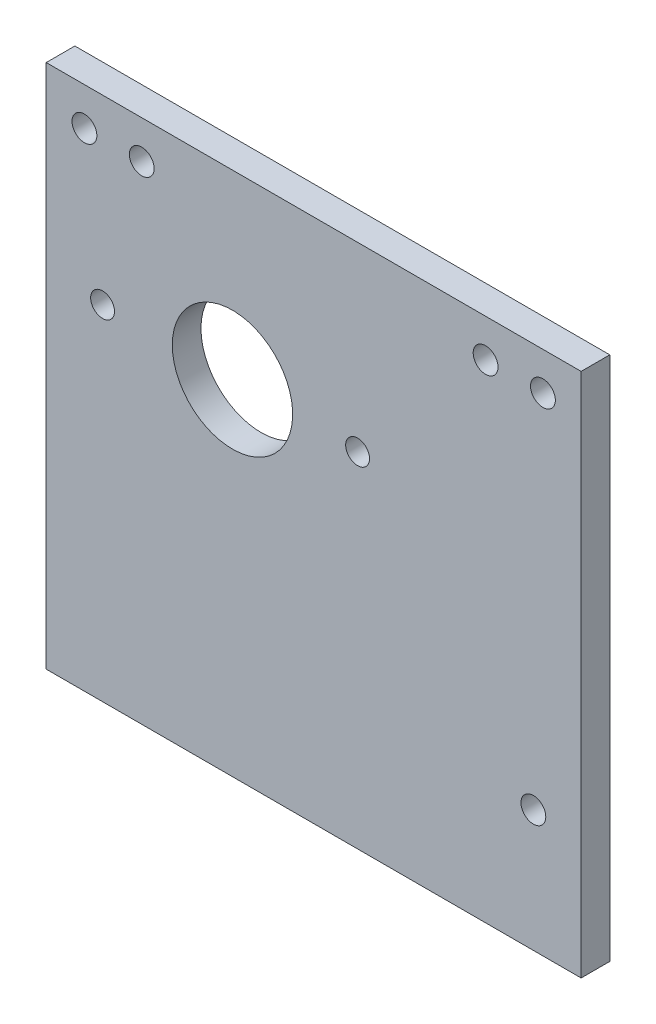
ISO-10303-21;
HEADER;
FILE_DESCRIPTION(('STEP AP214'),'2;1');
FILE_NAME('part.step','',(''),(''),'','','');
FILE_SCHEMA(('AUTOMOTIVE_DESIGN { 1 0 10303 214 1 1 1 1 }'));
ENDSEC;
DATA;
#1=APPLICATION_CONTEXT('core data for automotive mechanical design processes');
#2=APPLICATION_PROTOCOL_DEFINITION('international standard','automotive_design',2000,#1);
#3=PRODUCT_CONTEXT('',#1,'mechanical');
#4=PRODUCT('Part','Part','',(#3));
#5=PRODUCT_RELATED_PRODUCT_CATEGORY('part','',(#4));
#6=PRODUCT_DEFINITION_FORMATION('','',#4);
#7=PRODUCT_DEFINITION_CONTEXT('part definition',#1,'design');
#8=PRODUCT_DEFINITION('design','',#6,#7);
#9=PRODUCT_DEFINITION_SHAPE('','',#8);
#10=(LENGTH_UNIT() NAMED_UNIT(*) SI_UNIT(.MILLI.,.METRE.));
#11=(NAMED_UNIT(*) PLANE_ANGLE_UNIT() SI_UNIT($,.RADIAN.));
#12=(NAMED_UNIT(*) SI_UNIT($,.STERADIAN.) SOLID_ANGLE_UNIT());
#13=UNCERTAINTY_MEASURE_WITH_UNIT(LENGTH_MEASURE(1.E-05),#10,'distance_accuracy_value','');
#14=(GEOMETRIC_REPRESENTATION_CONTEXT(3) GLOBAL_UNCERTAINTY_ASSIGNED_CONTEXT((#13)) GLOBAL_UNIT_ASSIGNED_CONTEXT((#10,
#11,#12)) REPRESENTATION_CONTEXT('',''));
#15=CARTESIAN_POINT('',(0.,0.,0.));
#16=DIRECTION('',(0.,0.,1.));
#17=DIRECTION('',(1.,0.,0.));
#18=AXIS2_PLACEMENT_3D('',#15,#16,#17);
#19=CARTESIAN_POINT('',(29.5,-27.5,3.));
#20=DIRECTION('',(-1.,0.,0.));
#21=DIRECTION('',(0.,0.,1.));
#22=AXIS2_PLACEMENT_3D('',#19,#20,#21);
#23=PLANE('',#22);
#24=DIRECTION('',(0.,1.,0.));
#25=VECTOR('',#24,1.);
#26=CARTESIAN_POINT('',(29.5,-27.5,0.));
#27=LINE('',#26,#25);
#28=CARTESIAN_POINT('',(29.5,-27.5,0.));
#29=VERTEX_POINT('',#28);
#30=CARTESIAN_POINT('',(29.5,27.5,0.));
#31=VERTEX_POINT('',#30);
#32=EDGE_CURVE('E100',#29,#31,#27,.T.);
#33=ORIENTED_EDGE('',*,*,#32,.T.);
#34=DIRECTION('',(0.,0.,-1.));
#35=VECTOR('',#34,1.);
#36=CARTESIAN_POINT('',(29.5,27.5,3.));
#37=LINE('',#36,#35);
#38=CARTESIAN_POINT('',(29.5,27.5,3.));
#39=VERTEX_POINT('',#38);
#40=EDGE_CURVE('E11',#39,#31,#37,.T.);
#41=ORIENTED_EDGE('',*,*,#40,.F.);
#42=DIRECTION('',(0.,1.,0.));
#43=VECTOR('',#42,1.);
#44=CARTESIAN_POINT('',(29.5,-27.5,3.));
#45=LINE('',#44,#43);
#46=CARTESIAN_POINT('',(29.5,-27.5,3.));
#47=VERTEX_POINT('',#46);
#48=EDGE_CURVE('E87',#47,#39,#45,.T.);
#49=ORIENTED_EDGE('',*,*,#48,.F.);
#50=DIRECTION('',(0.,0.,-1.));
#51=VECTOR('',#50,1.);
#52=CARTESIAN_POINT('',(29.5,-27.5,3.));
#53=LINE('',#52,#51);
#54=EDGE_CURVE('E96',#47,#29,#53,.T.);
#55=ORIENTED_EDGE('',*,*,#54,.T.);
#56=EDGE_LOOP('',(#33,#41,#49,#55));
#57=FACE_BOUND('',#56,.T.);
#58=ADVANCED_FACE('F34',(#57),#23,.F.);
#59=CARTESIAN_POINT('',(-26.5,27.5,3.));
#60=DIRECTION('',(0.,-1.,0.));
#61=DIRECTION('',(0.,0.,-1.));
#62=AXIS2_PLACEMENT_3D('',#59,#60,#61);
#63=PLANE('',#62);
#64=DIRECTION('',(-1.,0.,0.));
#65=VECTOR('',#64,1.);
#66=CARTESIAN_POINT('',(-26.5,27.5,0.));
#67=LINE('',#66,#65);
#68=CARTESIAN_POINT('',(-26.5,27.5,0.));
#69=VERTEX_POINT('',#68);
#70=EDGE_CURVE('E91',#31,#69,#67,.T.);
#71=ORIENTED_EDGE('',*,*,#70,.T.);
#72=DIRECTION('',(0.,0.,-1.));
#73=VECTOR('',#72,1.);
#74=CARTESIAN_POINT('',(-26.5,27.5,3.));
#75=LINE('',#74,#73);
#76=CARTESIAN_POINT('',(-26.5,27.5,3.));
#77=VERTEX_POINT('',#76);
#78=EDGE_CURVE('E43',#77,#69,#75,.T.);
#79=ORIENTED_EDGE('',*,*,#78,.F.);
#80=DIRECTION('',(-1.,0.,0.));
#81=VECTOR('',#80,1.);
#82=CARTESIAN_POINT('',(-26.5,27.5,3.));
#83=LINE('',#82,#81);
#84=EDGE_CURVE('E82',#39,#77,#83,.T.);
#85=ORIENTED_EDGE('',*,*,#84,.F.);
#86=ORIENTED_EDGE('',*,*,#40,.T.);
#87=EDGE_LOOP('',(#71,#79,#85,#86));
#88=FACE_BOUND('',#87,.T.);
#89=ADVANCED_FACE('F90',(#88),#63,.F.);
#90=CARTESIAN_POINT('',(-26.5,-27.5,3.));
#91=DIRECTION('',(1.,0.,0.));
#92=DIRECTION('',(0.,0.,-1.));
#93=AXIS2_PLACEMENT_3D('',#90,#91,#92);
#94=PLANE('',#93);
#95=DIRECTION('',(0.,-1.,0.));
#96=VECTOR('',#95,1.);
#97=CARTESIAN_POINT('',(-26.5,-27.5,0.));
#98=LINE('',#97,#96);
#99=CARTESIAN_POINT('',(-26.5,-27.5,0.));
#100=VERTEX_POINT('',#99);
#101=EDGE_CURVE('E69',#69,#100,#98,.T.);
#102=ORIENTED_EDGE('',*,*,#101,.T.);
#103=DIRECTION('',(0.,0.,-1.));
#104=VECTOR('',#103,1.);
#105=CARTESIAN_POINT('',(-26.5,-27.5,3.));
#106=LINE('',#105,#104);
#107=CARTESIAN_POINT('',(-26.5,-27.5,3.));
#108=VERTEX_POINT('',#107);
#109=EDGE_CURVE('E92',#108,#100,#106,.T.);
#110=ORIENTED_EDGE('',*,*,#109,.F.);
#111=DIRECTION('',(0.,-1.,0.));
#112=VECTOR('',#111,1.);
#113=CARTESIAN_POINT('',(-26.5,-27.5,3.));
#114=LINE('',#113,#112);
#115=EDGE_CURVE('E85',#77,#108,#114,.T.);
#116=ORIENTED_EDGE('',*,*,#115,.F.);
#117=ORIENTED_EDGE('',*,*,#78,.T.);
#118=EDGE_LOOP('',(#102,#110,#116,#117));
#119=FACE_BOUND('',#118,.T.);
#120=ADVANCED_FACE('F94',(#119),#94,.F.);
#121=CARTESIAN_POINT('',(-26.5,-27.5,3.));
#122=DIRECTION('',(0.,1.,0.));
#123=DIRECTION('',(0.,0.,1.));
#124=AXIS2_PLACEMENT_3D('',#121,#122,#123);
#125=PLANE('',#124);
#126=DIRECTION('',(1.,0.,0.));
#127=VECTOR('',#126,1.);
#128=CARTESIAN_POINT('',(-26.5,-27.5,0.));
#129=LINE('',#128,#127);
#130=EDGE_CURVE('E75',#100,#29,#129,.T.);
#131=ORIENTED_EDGE('',*,*,#130,.T.);
#132=ORIENTED_EDGE('',*,*,#54,.F.);
#133=DIRECTION('',(1.,0.,0.));
#134=VECTOR('',#133,1.);
#135=CARTESIAN_POINT('',(-26.5,-27.5,3.));
#136=LINE('',#135,#134);
#137=EDGE_CURVE('E52',#108,#47,#136,.T.);
#138=ORIENTED_EDGE('',*,*,#137,.F.);
#139=ORIENTED_EDGE('',*,*,#109,.T.);
#140=EDGE_LOOP('',(#131,#132,#138,#139));
#141=FACE_BOUND('',#140,.T.);
#142=ADVANCED_FACE('F142',(#141),#125,.F.);
#143=CARTESIAN_POINT('',(0.,0.,3.));
#144=DIRECTION('',(0.,0.,-1.));
#145=DIRECTION('',(-1.,0.,0.));
#146=AXIS2_PLACEMENT_3D('',#143,#144,#145);
#147=PLANE('',#146);
#148=CARTESIAN_POINT('',(6.1,8.5,3.));
#149=DIRECTION('',(0.,0.,-1.));
#150=DIRECTION('',(-1.,0.,0.));
#151=AXIS2_PLACEMENT_3D('',#148,#149,#150);
#152=CIRCLE('',#151,1.25);
#153=CARTESIAN_POINT('',(4.85,8.5,3.));
#154=VERTEX_POINT('',#153);
#155=EDGE_CURVE('E264',#154,#154,#152,.T.);
#156=ORIENTED_EDGE('',*,*,#155,.T.);
#157=EDGE_LOOP('',(#156));
#158=FACE_BOUND('',#157,.T.);
#159=CARTESIAN_POINT('',(-20.6,8.5,3.));
#160=DIRECTION('',(0.,0.,-1.));
#161=DIRECTION('',(-1.,0.,0.));
#162=AXIS2_PLACEMENT_3D('',#159,#160,#161);
#163=CIRCLE('',#162,1.25);
#164=CARTESIAN_POINT('',(-21.85,8.5,3.));
#165=VERTEX_POINT('',#164);
#166=EDGE_CURVE('E266',#165,#165,#163,.T.);
#167=ORIENTED_EDGE('',*,*,#166,.T.);
#168=EDGE_LOOP('',(#167));
#169=FACE_BOUND('',#168,.T.);
#170=CARTESIAN_POINT('',(-7.,8.49999999999999,3.));
#171=DIRECTION('',(0.,0.,-1.));
#172=DIRECTION('',(-1.,0.,0.));
#173=AXIS2_PLACEMENT_3D('',#170,#171,#172);
#174=CIRCLE('',#173,6.3);
#175=CARTESIAN_POINT('',(-13.3,8.49999999999999,3.));
#176=VERTEX_POINT('',#175);
#177=EDGE_CURVE('E272',#176,#176,#174,.T.);
#178=ORIENTED_EDGE('',*,*,#177,.T.);
#179=EDGE_LOOP('',(#178));
#180=FACE_BOUND('',#179,.T.);
#181=CARTESIAN_POINT('',(19.5,23.5288247249118,3.));
#182=DIRECTION('',(0.,0.,1.));
#183=DIRECTION('',(1.,0.,0.));
#184=AXIS2_PLACEMENT_3D('',#181,#182,#183);
#185=CIRCLE('',#184,1.3);
#186=CARTESIAN_POINT('',(20.8,23.5288247249118,3.));
#187=VERTEX_POINT('',#186);
#188=EDGE_CURVE('E265',#187,#187,#185,.T.);
#189=ORIENTED_EDGE('',*,*,#188,.F.);
#190=EDGE_LOOP('',(#189));
#191=FACE_BOUND('',#190,.T.);
#192=CARTESIAN_POINT('',(-22.5,23.5288247249118,3.));
#193=DIRECTION('',(0.,0.,1.));
#194=DIRECTION('',(1.,0.,0.));
#195=AXIS2_PLACEMENT_3D('',#192,#193,#194);
#196=CIRCLE('',#195,1.3);
#197=CARTESIAN_POINT('',(-21.2,23.5288247249118,3.));
#198=VERTEX_POINT('',#197);
#199=EDGE_CURVE('E269',#198,#198,#196,.T.);
#200=ORIENTED_EDGE('',*,*,#199,.F.);
#201=EDGE_LOOP('',(#200));
#202=FACE_BOUND('',#201,.T.);
#203=CARTESIAN_POINT('',(24.5,-14.75,3.));
#204=DIRECTION('',(0.,0.,1.));
#205=DIRECTION('',(1.,0.,0.));
#206=AXIS2_PLACEMENT_3D('',#203,#204,#205);
#207=CIRCLE('',#206,1.29999999999999);
#208=CARTESIAN_POINT('',(25.8,-14.75,3.));
#209=VERTEX_POINT('',#208);
#210=EDGE_CURVE('E279',#209,#209,#207,.T.);
#211=ORIENTED_EDGE('',*,*,#210,.F.);
#212=EDGE_LOOP('',(#211));
#213=FACE_BOUND('',#212,.T.);
#214=CARTESIAN_POINT('',(25.5,23.5288247249118,3.));
#215=DIRECTION('',(0.,0.,1.));
#216=DIRECTION('',(1.,0.,0.));
#217=AXIS2_PLACEMENT_3D('',#214,#215,#216);
#218=CIRCLE('',#217,1.3);
#219=CARTESIAN_POINT('',(26.8,23.5288247249118,3.));
#220=VERTEX_POINT('',#219);
#221=EDGE_CURVE('E276',#220,#220,#218,.T.);
#222=ORIENTED_EDGE('',*,*,#221,.F.);
#223=EDGE_LOOP('',(#222));
#224=FACE_BOUND('',#223,.T.);
#225=CARTESIAN_POINT('',(-16.5,23.5288247249118,3.));
#226=DIRECTION('',(0.,0.,1.));
#227=DIRECTION('',(1.,0.,0.));
#228=AXIS2_PLACEMENT_3D('',#225,#226,#227);
#229=CIRCLE('',#228,1.3);
#230=CARTESIAN_POINT('',(-15.2,23.5288247249118,3.));
#231=VERTEX_POINT('',#230);
#232=EDGE_CURVE('E112',#231,#231,#229,.T.);
#233=ORIENTED_EDGE('',*,*,#232,.F.);
#234=EDGE_LOOP('',(#233));
#235=FACE_BOUND('',#234,.T.);
#236=ORIENTED_EDGE('',*,*,#48,.T.);
#237=ORIENTED_EDGE('',*,*,#84,.T.);
#238=ORIENTED_EDGE('',*,*,#115,.T.);
#239=ORIENTED_EDGE('',*,*,#137,.T.);
#240=EDGE_LOOP('',(#236,#237,#238,#239));
#241=FACE_BOUND('',#240,.T.);
#242=ADVANCED_FACE('F83',(#158,#169,#180,#191,#202,#213,#224,#235,#241),#147,.F.);
#243=CARTESIAN_POINT('',(0.,0.,0.));
#244=DIRECTION('',(0.,0.,-1.));
#245=DIRECTION('',(-1.,0.,0.));
#246=AXIS2_PLACEMENT_3D('',#243,#244,#245);
#247=PLANE('',#246);
#248=CARTESIAN_POINT('',(6.1,8.5,0.));
#249=DIRECTION('',(0.,0.,-1.));
#250=DIRECTION('',(-1.,0.,0.));
#251=AXIS2_PLACEMENT_3D('',#248,#249,#250);
#252=CIRCLE('',#251,1.25);
#253=CARTESIAN_POINT('',(4.85,8.5,0.));
#254=VERTEX_POINT('',#253);
#255=EDGE_CURVE('E261',#254,#254,#252,.T.);
#256=ORIENTED_EDGE('',*,*,#255,.F.);
#257=EDGE_LOOP('',(#256));
#258=FACE_BOUND('',#257,.T.);
#259=CARTESIAN_POINT('',(-20.6,8.5,0.));
#260=DIRECTION('',(0.,0.,-1.));
#261=DIRECTION('',(-1.,0.,0.));
#262=AXIS2_PLACEMENT_3D('',#259,#260,#261);
#263=CIRCLE('',#262,1.25);
#264=CARTESIAN_POINT('',(-21.85,8.5,0.));
#265=VERTEX_POINT('',#264);
#266=EDGE_CURVE('E302',#265,#265,#263,.T.);
#267=ORIENTED_EDGE('',*,*,#266,.F.);
#268=EDGE_LOOP('',(#267));
#269=FACE_BOUND('',#268,.T.);
#270=CARTESIAN_POINT('',(-7.,8.49999999999999,0.));
#271=DIRECTION('',(0.,0.,-1.));
#272=DIRECTION('',(-1.,0.,0.));
#273=AXIS2_PLACEMENT_3D('',#270,#271,#272);
#274=CIRCLE('',#273,6.3);
#275=CARTESIAN_POINT('',(-13.3,8.49999999999999,0.));
#276=VERTEX_POINT('',#275);
#277=EDGE_CURVE('E299',#276,#276,#274,.T.);
#278=ORIENTED_EDGE('',*,*,#277,.F.);
#279=EDGE_LOOP('',(#278));
#280=FACE_BOUND('',#279,.T.);
#281=CARTESIAN_POINT('',(19.5,23.5288247249118,0.));
#282=DIRECTION('',(0.,0.,-1.));
#283=DIRECTION('',(-1.,0.,0.));
#284=AXIS2_PLACEMENT_3D('',#281,#282,#283);
#285=CIRCLE('',#284,1.3);
#286=CARTESIAN_POINT('',(18.2,23.5288247249118,0.));
#287=VERTEX_POINT('',#286);
#288=EDGE_CURVE('E37',#287,#287,#285,.T.);
#289=ORIENTED_EDGE('',*,*,#288,.F.);
#290=EDGE_LOOP('',(#289));
#291=FACE_BOUND('',#290,.T.);
#292=CARTESIAN_POINT('',(-22.5,23.5288247249118,0.));
#293=DIRECTION('',(0.,0.,-1.));
#294=DIRECTION('',(-1.,0.,0.));
#295=AXIS2_PLACEMENT_3D('',#292,#293,#294);
#296=CIRCLE('',#295,1.3);
#297=CARTESIAN_POINT('',(-23.8,23.5288247249118,0.));
#298=VERTEX_POINT('',#297);
#299=EDGE_CURVE('E117',#298,#298,#296,.T.);
#300=ORIENTED_EDGE('',*,*,#299,.F.);
#301=EDGE_LOOP('',(#300));
#302=FACE_BOUND('',#301,.T.);
#303=CARTESIAN_POINT('',(24.5,-14.75,0.));
#304=DIRECTION('',(0.,0.,-1.));
#305=DIRECTION('',(-1.,0.,0.));
#306=AXIS2_PLACEMENT_3D('',#303,#304,#305);
#307=CIRCLE('',#306,1.29999999999999);
#308=CARTESIAN_POINT('',(23.2,-14.75,0.));
#309=VERTEX_POINT('',#308);
#310=EDGE_CURVE('E115',#309,#309,#307,.T.);
#311=ORIENTED_EDGE('',*,*,#310,.F.);
#312=EDGE_LOOP('',(#311));
#313=FACE_BOUND('',#312,.T.);
#314=CARTESIAN_POINT('',(25.5,23.5288247249118,0.));
#315=DIRECTION('',(0.,0.,-1.));
#316=DIRECTION('',(-1.,0.,0.));
#317=AXIS2_PLACEMENT_3D('',#314,#315,#316);
#318=CIRCLE('',#317,1.3);
#319=CARTESIAN_POINT('',(24.2,23.5288247249118,0.));
#320=VERTEX_POINT('',#319);
#321=EDGE_CURVE('E111',#320,#320,#318,.T.);
#322=ORIENTED_EDGE('',*,*,#321,.F.);
#323=EDGE_LOOP('',(#322));
#324=FACE_BOUND('',#323,.T.);
#325=CARTESIAN_POINT('',(-16.5,23.5288247249118,0.));
#326=DIRECTION('',(0.,0.,-1.));
#327=DIRECTION('',(-1.,0.,0.));
#328=AXIS2_PLACEMENT_3D('',#325,#326,#327);
#329=CIRCLE('',#328,1.3);
#330=CARTESIAN_POINT('',(-17.8,23.5288247249118,0.));
#331=VERTEX_POINT('',#330);
#332=EDGE_CURVE('E108',#331,#331,#329,.T.);
#333=ORIENTED_EDGE('',*,*,#332,.F.);
#334=EDGE_LOOP('',(#333));
#335=FACE_BOUND('',#334,.T.);
#336=ORIENTED_EDGE('',*,*,#32,.F.);
#337=ORIENTED_EDGE('',*,*,#130,.F.);
#338=ORIENTED_EDGE('',*,*,#101,.F.);
#339=ORIENTED_EDGE('',*,*,#70,.F.);
#340=EDGE_LOOP('',(#336,#337,#338,#339));
#341=FACE_BOUND('',#340,.T.);
#342=ADVANCED_FACE('F127',(#258,#269,#280,#291,#302,#313,#324,#335,#341),#247,.T.);
#343=CARTESIAN_POINT('',(-16.5,23.5288247249118,-1.));
#344=DIRECTION('',(0.,0.,1.));
#345=DIRECTION('',(1.,0.,0.));
#346=AXIS2_PLACEMENT_3D('',#343,#344,#345);
#347=CYLINDRICAL_SURFACE('',#346,1.3);
#348=ORIENTED_EDGE('',*,*,#332,.T.);
#349=EDGE_LOOP('',(#348));
#350=FACE_BOUND('',#349,.T.);
#351=ORIENTED_EDGE('',*,*,#232,.T.);
#352=EDGE_LOOP('',(#351));
#353=FACE_BOUND('',#352,.T.);
#354=ADVANCED_FACE('F130',(#350,#353),#347,.F.);
#355=CARTESIAN_POINT('',(25.5,23.5288247249118,-1.));
#356=DIRECTION('',(0.,0.,1.));
#357=DIRECTION('',(1.,0.,0.));
#358=AXIS2_PLACEMENT_3D('',#355,#356,#357);
#359=CYLINDRICAL_SURFACE('',#358,1.3);
#360=ORIENTED_EDGE('',*,*,#321,.T.);
#361=EDGE_LOOP('',(#360));
#362=FACE_BOUND('',#361,.T.);
#363=ORIENTED_EDGE('',*,*,#221,.T.);
#364=EDGE_LOOP('',(#363));
#365=FACE_BOUND('',#364,.T.);
#366=ADVANCED_FACE('F176',(#362,#365),#359,.F.);
#367=CARTESIAN_POINT('',(24.5,-14.75,-1.));
#368=DIRECTION('',(0.,0.,1.));
#369=DIRECTION('',(1.,0.,0.));
#370=AXIS2_PLACEMENT_3D('',#367,#368,#369);
#371=CYLINDRICAL_SURFACE('',#370,1.29999999999999);
#372=ORIENTED_EDGE('',*,*,#310,.T.);
#373=EDGE_LOOP('',(#372));
#374=FACE_BOUND('',#373,.T.);
#375=ORIENTED_EDGE('',*,*,#210,.T.);
#376=EDGE_LOOP('',(#375));
#377=FACE_BOUND('',#376,.T.);
#378=ADVANCED_FACE('F187',(#374,#377),#371,.F.);
#379=CARTESIAN_POINT('',(-22.5,23.5288247249118,-1.));
#380=DIRECTION('',(0.,0.,1.));
#381=DIRECTION('',(1.,0.,0.));
#382=AXIS2_PLACEMENT_3D('',#379,#380,#381);
#383=CYLINDRICAL_SURFACE('',#382,1.3);
#384=ORIENTED_EDGE('',*,*,#299,.T.);
#385=EDGE_LOOP('',(#384));
#386=FACE_BOUND('',#385,.T.);
#387=ORIENTED_EDGE('',*,*,#199,.T.);
#388=EDGE_LOOP('',(#387));
#389=FACE_BOUND('',#388,.T.);
#390=ADVANCED_FACE('F197',(#386,#389),#383,.F.);
#391=CARTESIAN_POINT('',(19.5,23.5288247249118,-1.));
#392=DIRECTION('',(0.,0.,1.));
#393=DIRECTION('',(1.,0.,0.));
#394=AXIS2_PLACEMENT_3D('',#391,#392,#393);
#395=CYLINDRICAL_SURFACE('',#394,1.3);
#396=ORIENTED_EDGE('',*,*,#288,.T.);
#397=EDGE_LOOP('',(#396));
#398=FACE_BOUND('',#397,.T.);
#399=ORIENTED_EDGE('',*,*,#188,.T.);
#400=EDGE_LOOP('',(#399));
#401=FACE_BOUND('',#400,.T.);
#402=ADVANCED_FACE('F124',(#398,#401),#395,.F.);
#403=CARTESIAN_POINT('',(-7.,8.49999999999999,4.));
#404=DIRECTION('',(0.,0.,-1.));
#405=DIRECTION('',(-1.,0.,0.));
#406=AXIS2_PLACEMENT_3D('',#403,#404,#405);
#407=CYLINDRICAL_SURFACE('',#406,6.3);
#408=ORIENTED_EDGE('',*,*,#277,.T.);
#409=EDGE_LOOP('',(#408));
#410=FACE_BOUND('',#409,.T.);
#411=ORIENTED_EDGE('',*,*,#177,.F.);
#412=EDGE_LOOP('',(#411));
#413=FACE_BOUND('',#412,.T.);
#414=ADVANCED_FACE('F215',(#410,#413),#407,.F.);
#415=CARTESIAN_POINT('',(-20.6,8.5,4.));
#416=DIRECTION('',(0.,0.,-1.));
#417=DIRECTION('',(-1.,0.,0.));
#418=AXIS2_PLACEMENT_3D('',#415,#416,#417);
#419=CYLINDRICAL_SURFACE('',#418,1.25);
#420=ORIENTED_EDGE('',*,*,#266,.T.);
#421=EDGE_LOOP('',(#420));
#422=FACE_BOUND('',#421,.T.);
#423=ORIENTED_EDGE('',*,*,#166,.F.);
#424=EDGE_LOOP('',(#423));
#425=FACE_BOUND('',#424,.T.);
#426=ADVANCED_FACE('F234',(#422,#425),#419,.F.);
#427=CARTESIAN_POINT('',(6.1,8.5,4.));
#428=DIRECTION('',(0.,0.,-1.));
#429=DIRECTION('',(-1.,0.,0.));
#430=AXIS2_PLACEMENT_3D('',#427,#428,#429);
#431=CYLINDRICAL_SURFACE('',#430,1.25);
#432=ORIENTED_EDGE('',*,*,#255,.T.);
#433=EDGE_LOOP('',(#432));
#434=FACE_BOUND('',#433,.T.);
#435=ORIENTED_EDGE('',*,*,#155,.F.);
#436=EDGE_LOOP('',(#435));
#437=FACE_BOUND('',#436,.T.);
#438=ADVANCED_FACE('F244',(#434,#437),#431,.F.);
#439=CLOSED_SHELL('',(#58,#89,#120,#142,#242,#342,#354,#366,#378,#390,#402,#414,#426,#438));
#440=MANIFOLD_SOLID_BREP('B2',#439);
#441=ADVANCED_BREP_SHAPE_REPRESENTATION('',(#18,#440),#14);
#442=SHAPE_DEFINITION_REPRESENTATION(#9,#441);
ENDSEC;
END-ISO-10303-21;
